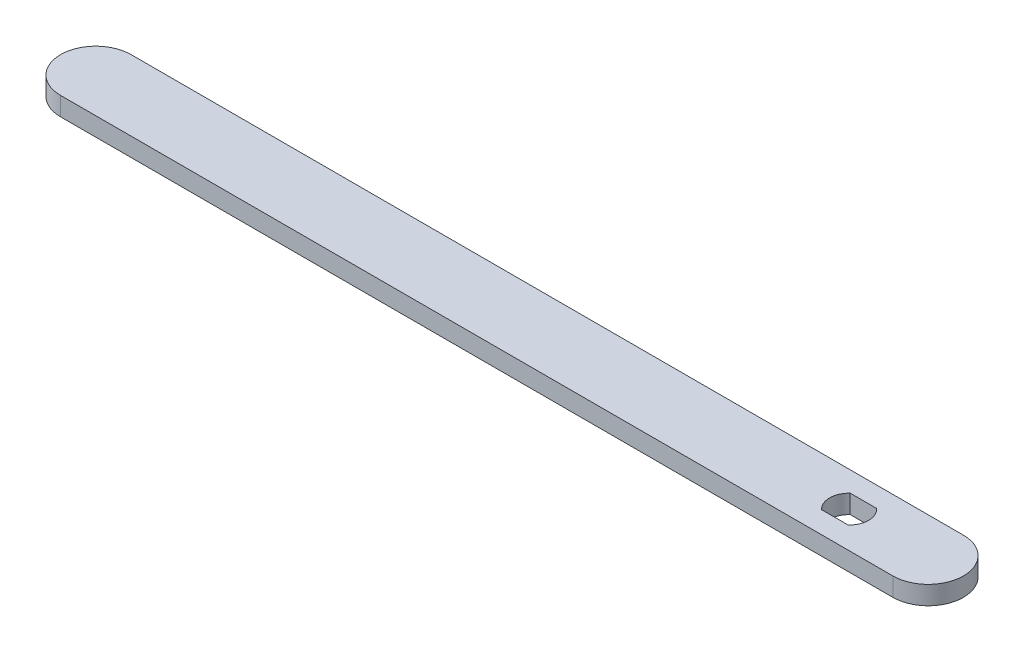
ISO-10303-21;
HEADER;
FILE_DESCRIPTION(('STEP AP214'),'2;1');
FILE_NAME('part.step','',(''),(''),'','','');
FILE_SCHEMA(('AUTOMOTIVE_DESIGN { 1 0 10303 214 1 1 1 1 }'));
ENDSEC;
DATA;
#1=APPLICATION_CONTEXT('core data for automotive mechanical design processes');
#2=APPLICATION_PROTOCOL_DEFINITION('international standard','automotive_design',2000,#1);
#3=PRODUCT_CONTEXT('',#1,'mechanical');
#4=PRODUCT('Part','Part','',(#3));
#5=PRODUCT_RELATED_PRODUCT_CATEGORY('part','',(#4));
#6=PRODUCT_DEFINITION_FORMATION('','',#4);
#7=PRODUCT_DEFINITION_CONTEXT('part definition',#1,'design');
#8=PRODUCT_DEFINITION('design','',#6,#7);
#9=PRODUCT_DEFINITION_SHAPE('','',#8);
#10=(LENGTH_UNIT() NAMED_UNIT(*) SI_UNIT(.MILLI.,.METRE.));
#11=(NAMED_UNIT(*) PLANE_ANGLE_UNIT() SI_UNIT($,.RADIAN.));
#12=(NAMED_UNIT(*) SI_UNIT($,.STERADIAN.) SOLID_ANGLE_UNIT());
#13=UNCERTAINTY_MEASURE_WITH_UNIT(LENGTH_MEASURE(1.E-05),#10,'distance_accuracy_value','');
#14=(GEOMETRIC_REPRESENTATION_CONTEXT(3) GLOBAL_UNCERTAINTY_ASSIGNED_CONTEXT((#13)) GLOBAL_UNIT_ASSIGNED_CONTEXT((#10,
#11,#12)) REPRESENTATION_CONTEXT('',''));
#15=CARTESIAN_POINT('',(0.,0.,0.));
#16=DIRECTION('',(0.,0.,1.));
#17=DIRECTION('',(1.,0.,0.));
#18=AXIS2_PLACEMENT_3D('',#15,#16,#17);
#19=CARTESIAN_POINT('',(-11.5300829875519,2.5,0.));
#20=DIRECTION('',(0.,-1.,0.));
#21=DIRECTION('',(0.,0.,-1.));
#22=AXIS2_PLACEMENT_3D('',#19,#20,#21);
#23=CYLINDRICAL_SURFACE('',#22,4.75);
#24=CARTESIAN_POINT('',(-11.5300829875519,0.,0.));
#25=DIRECTION('',(0.,1.,0.));
#26=DIRECTION('',(0.,0.,1.));
#27=AXIS2_PLACEMENT_3D('',#24,#25,#26);
#28=CIRCLE('',#27,4.75);
#29=CARTESIAN_POINT('',(-11.5300829875519,0.,-4.75));
#30=VERTEX_POINT('',#29);
#31=CARTESIAN_POINT('',(-11.5300829875519,0.,4.75));
#32=VERTEX_POINT('',#31);
#33=EDGE_CURVE('E154',#30,#32,#28,.T.);
#34=ORIENTED_EDGE('',*,*,#33,.T.);
#35=DIRECTION('',(0.,-1.,0.));
#36=VECTOR('',#35,1.);
#37=CARTESIAN_POINT('',(-11.5300829875519,2.5,4.75));
#38=LINE('',#37,#36);
#39=CARTESIAN_POINT('',(-11.5300829875519,2.5,4.75));
#40=VERTEX_POINT('',#39);
#41=EDGE_CURVE('E11',#40,#32,#38,.T.);
#42=ORIENTED_EDGE('',*,*,#41,.F.);
#43=CARTESIAN_POINT('',(-11.5300829875519,2.5,0.));
#44=DIRECTION('',(0.,1.,0.));
#45=DIRECTION('',(0.,0.,1.));
#46=AXIS2_PLACEMENT_3D('',#43,#44,#45);
#47=CIRCLE('',#46,4.75);
#48=CARTESIAN_POINT('',(-11.5300829875519,2.5,-4.75));
#49=VERTEX_POINT('',#48);
#50=EDGE_CURVE('E163',#49,#40,#47,.T.);
#51=ORIENTED_EDGE('',*,*,#50,.F.);
#52=DIRECTION('',(0.,-1.,0.));
#53=VECTOR('',#52,1.);
#54=CARTESIAN_POINT('',(-11.5300829875519,2.5,-4.75));
#55=LINE('',#54,#53);
#56=EDGE_CURVE('E119',#49,#30,#55,.T.);
#57=ORIENTED_EDGE('',*,*,#56,.T.);
#58=EDGE_LOOP('',(#34,#42,#51,#57));
#59=FACE_BOUND('',#58,.T.);
#60=ADVANCED_FACE('F47',(#59),#23,.T.);
#61=CARTESIAN_POINT('',(-11.5300829875519,2.5,4.75));
#62=DIRECTION('',(0.,0.,-1.));
#63=DIRECTION('',(-1.,0.,0.));
#64=AXIS2_PLACEMENT_3D('',#61,#62,#63);
#65=PLANE('',#64);
#66=DIRECTION('',(1.,0.,0.));
#67=VECTOR('',#66,1.);
#68=CARTESIAN_POINT('',(-11.5300829875519,0.,4.75));
#69=LINE('',#68,#67);
#70=CARTESIAN_POINT('',(100.469917012448,0.,4.75));
#71=VERTEX_POINT('',#70);
#72=EDGE_CURVE('E103',#32,#71,#69,.T.);
#73=ORIENTED_EDGE('',*,*,#72,.T.);
#74=DIRECTION('',(0.,-1.,0.));
#75=VECTOR('',#74,1.);
#76=CARTESIAN_POINT('',(100.469917012448,2.5,4.75));
#77=LINE('',#76,#75);
#78=CARTESIAN_POINT('',(100.469917012448,2.5,4.75));
#79=VERTEX_POINT('',#78);
#80=EDGE_CURVE('E56',#79,#71,#77,.T.);
#81=ORIENTED_EDGE('',*,*,#80,.F.);
#82=DIRECTION('',(1.,0.,0.));
#83=VECTOR('',#82,1.);
#84=CARTESIAN_POINT('',(-11.5300829875519,2.5,4.75));
#85=LINE('',#84,#83);
#86=EDGE_CURVE('E126',#40,#79,#85,.T.);
#87=ORIENTED_EDGE('',*,*,#86,.F.);
#88=ORIENTED_EDGE('',*,*,#41,.T.);
#89=EDGE_LOOP('',(#73,#81,#87,#88));
#90=FACE_BOUND('',#89,.T.);
#91=ADVANCED_FACE('F200',(#90),#65,.F.);
#92=CARTESIAN_POINT('',(100.469917012448,2.5,0.));
#93=DIRECTION('',(0.,-1.,0.));
#94=DIRECTION('',(0.,0.,-1.));
#95=AXIS2_PLACEMENT_3D('',#92,#93,#94);
#96=CYLINDRICAL_SURFACE('',#95,4.75);
#97=CARTESIAN_POINT('',(100.469917012448,0.,0.));
#98=DIRECTION('',(0.,1.,0.));
#99=DIRECTION('',(0.,0.,1.));
#100=AXIS2_PLACEMENT_3D('',#97,#98,#99);
#101=CIRCLE('',#100,4.75);
#102=CARTESIAN_POINT('',(100.469917012448,0.,-4.75));
#103=VERTEX_POINT('',#102);
#104=EDGE_CURVE('E143',#71,#103,#101,.T.);
#105=ORIENTED_EDGE('',*,*,#104,.T.);
#106=DIRECTION('',(0.,-1.,0.));
#107=VECTOR('',#106,1.);
#108=CARTESIAN_POINT('',(100.469917012448,2.5,-4.75));
#109=LINE('',#108,#107);
#110=CARTESIAN_POINT('',(100.469917012448,2.5,-4.75));
#111=VERTEX_POINT('',#110);
#112=EDGE_CURVE('E112',#111,#103,#109,.T.);
#113=ORIENTED_EDGE('',*,*,#112,.F.);
#114=CARTESIAN_POINT('',(100.469917012448,2.5,0.));
#115=DIRECTION('',(0.,1.,0.));
#116=DIRECTION('',(0.,0.,1.));
#117=AXIS2_PLACEMENT_3D('',#114,#115,#116);
#118=CIRCLE('',#117,4.75);
#119=EDGE_CURVE('E135',#79,#111,#118,.T.);
#120=ORIENTED_EDGE('',*,*,#119,.F.);
#121=ORIENTED_EDGE('',*,*,#80,.T.);
#122=EDGE_LOOP('',(#105,#113,#120,#121));
#123=FACE_BOUND('',#122,.T.);
#124=ADVANCED_FACE('F142',(#123),#96,.T.);
#125=CARTESIAN_POINT('',(-11.5300829875519,2.5,-4.75));
#126=DIRECTION('',(0.,0.,-1.));
#127=DIRECTION('',(-1.,0.,0.));
#128=AXIS2_PLACEMENT_3D('',#125,#126,#127);
#129=PLANE('',#128);
#130=DIRECTION('',(1.,0.,0.));
#131=VECTOR('',#130,1.);
#132=CARTESIAN_POINT('',(-11.5300829875519,0.,-4.75));
#133=LINE('',#132,#131);
#134=EDGE_CURVE('E161',#30,#103,#133,.T.);
#135=ORIENTED_EDGE('',*,*,#134,.F.);
#136=ORIENTED_EDGE('',*,*,#56,.F.);
#137=DIRECTION('',(1.,0.,0.));
#138=VECTOR('',#137,1.);
#139=CARTESIAN_POINT('',(-11.5300829875519,2.5,-4.75));
#140=LINE('',#139,#138);
#141=EDGE_CURVE('E137',#49,#111,#140,.T.);
#142=ORIENTED_EDGE('',*,*,#141,.T.);
#143=ORIENTED_EDGE('',*,*,#112,.T.);
#144=EDGE_LOOP('',(#135,#136,#142,#143));
#145=FACE_BOUND('',#144,.T.);
#146=ADVANCED_FACE('F147',(#145),#129,.T.);
#147=CARTESIAN_POINT('',(-11.5300829875519,2.5,0.));
#148=DIRECTION('',(0.,1.,0.));
#149=DIRECTION('',(0.,0.,1.));
#150=AXIS2_PLACEMENT_3D('',#147,#148,#149);
#151=PLANE('',#150);
#152=CARTESIAN_POINT('',(89.7391086353592,2.5,-0.100316283306491));
#153=DIRECTION('',(0.,1.,0.));
#154=DIRECTION('',(0.,0.,1.));
#155=AXIS2_PLACEMENT_3D('',#152,#153,#154);
#156=CIRCLE('',#155,2.625);
#157=CARTESIAN_POINT('',(87.9544518056017,2.5,-2.02531628330649));
#158=VERTEX_POINT('',#157);
#159=CARTESIAN_POINT('',(87.9544518056017,2.5,1.82468371669351));
#160=VERTEX_POINT('',#159);
#161=EDGE_CURVE('E50',#158,#160,#156,.T.);
#162=ORIENTED_EDGE('',*,*,#161,.F.);
#163=DIRECTION('',(-1.,0.,0.));
#164=VECTOR('',#163,1.);
#165=CARTESIAN_POINT('',(87.9544518056017,2.5,-2.02531628330649));
#166=LINE('',#165,#164);
#167=CARTESIAN_POINT('',(91.5237654651166,2.5,-2.02531628330649));
#168=VERTEX_POINT('',#167);
#169=EDGE_CURVE('E94',#168,#158,#166,.T.);
#170=ORIENTED_EDGE('',*,*,#169,.F.);
#171=CARTESIAN_POINT('',(89.7391086353592,2.5,-0.100316283306491));
#172=DIRECTION('',(0.,1.,0.));
#173=DIRECTION('',(0.,0.,1.));
#174=AXIS2_PLACEMENT_3D('',#171,#172,#173);
#175=CIRCLE('',#174,2.625);
#176=CARTESIAN_POINT('',(91.5237654651166,2.5,1.82468371669351));
#177=VERTEX_POINT('',#176);
#178=EDGE_CURVE('E170',#177,#168,#175,.T.);
#179=ORIENTED_EDGE('',*,*,#178,.F.);
#180=DIRECTION('',(1.,0.,0.));
#181=VECTOR('',#180,1.);
#182=CARTESIAN_POINT('',(87.9544518056017,2.5,1.82468371669351));
#183=LINE('',#182,#181);
#184=EDGE_CURVE('E167',#160,#177,#183,.T.);
#185=ORIENTED_EDGE('',*,*,#184,.F.);
#186=EDGE_LOOP('',(#162,#170,#179,#185));
#187=FACE_BOUND('',#186,.T.);
#188=ORIENTED_EDGE('',*,*,#50,.T.);
#189=ORIENTED_EDGE('',*,*,#86,.T.);
#190=ORIENTED_EDGE('',*,*,#119,.T.);
#191=ORIENTED_EDGE('',*,*,#141,.F.);
#192=EDGE_LOOP('',(#188,#189,#190,#191));
#193=FACE_BOUND('',#192,.T.);
#194=ADVANCED_FACE('F136',(#187,#193),#151,.T.);
#195=CARTESIAN_POINT('',(-11.5300829875519,0.,0.));
#196=DIRECTION('',(0.,1.,0.));
#197=DIRECTION('',(0.,0.,1.));
#198=AXIS2_PLACEMENT_3D('',#195,#196,#197);
#199=PLANE('',#198);
#200=DIRECTION('',(-1.,0.,0.));
#201=VECTOR('',#200,1.);
#202=CARTESIAN_POINT('',(87.9544518056017,0.,-2.02531628330649));
#203=LINE('',#202,#201);
#204=CARTESIAN_POINT('',(91.5237654651166,0.,-2.02531628330649));
#205=VERTEX_POINT('',#204);
#206=CARTESIAN_POINT('',(87.9544518056017,0.,-2.02531628330649));
#207=VERTEX_POINT('',#206);
#208=EDGE_CURVE('E193',#205,#207,#203,.T.);
#209=ORIENTED_EDGE('',*,*,#208,.T.);
#210=CARTESIAN_POINT('',(89.7391086353592,0.,-0.100316283306491));
#211=DIRECTION('',(0.,1.,0.));
#212=DIRECTION('',(0.,0.,1.));
#213=AXIS2_PLACEMENT_3D('',#210,#211,#212);
#214=CIRCLE('',#213,2.625);
#215=CARTESIAN_POINT('',(87.9544518056017,0.,1.82468371669351));
#216=VERTEX_POINT('',#215);
#217=EDGE_CURVE('E327',#207,#216,#214,.T.);
#218=ORIENTED_EDGE('',*,*,#217,.T.);
#219=DIRECTION('',(1.,0.,0.));
#220=VECTOR('',#219,1.);
#221=CARTESIAN_POINT('',(87.9544518056017,0.,1.82468371669351));
#222=LINE('',#221,#220);
#223=CARTESIAN_POINT('',(91.5237654651166,0.,1.82468371669351));
#224=VERTEX_POINT('',#223);
#225=EDGE_CURVE('E332',#216,#224,#222,.T.);
#226=ORIENTED_EDGE('',*,*,#225,.T.);
#227=CARTESIAN_POINT('',(89.7391086353592,0.,-0.100316283306491));
#228=DIRECTION('',(0.,1.,0.));
#229=DIRECTION('',(0.,0.,1.));
#230=AXIS2_PLACEMENT_3D('',#227,#228,#229);
#231=CIRCLE('',#230,2.625);
#232=EDGE_CURVE('E73',#224,#205,#231,.T.);
#233=ORIENTED_EDGE('',*,*,#232,.T.);
#234=EDGE_LOOP('',(#209,#218,#226,#233));
#235=FACE_BOUND('',#234,.T.);
#236=ORIENTED_EDGE('',*,*,#33,.F.);
#237=ORIENTED_EDGE('',*,*,#134,.T.);
#238=ORIENTED_EDGE('',*,*,#104,.F.);
#239=ORIENTED_EDGE('',*,*,#72,.F.);
#240=EDGE_LOOP('',(#236,#237,#238,#239));
#241=FACE_BOUND('',#240,.T.);
#242=ADVANCED_FACE('F201',(#235,#241),#199,.F.);
#243=CARTESIAN_POINT('',(89.7391086353592,0.,-0.100316283306491));
#244=DIRECTION('',(0.,1.,0.));
#245=DIRECTION('',(0.,0.,1.));
#246=AXIS2_PLACEMENT_3D('',#243,#244,#245);
#247=CYLINDRICAL_SURFACE('',#246,2.625);
#248=ORIENTED_EDGE('',*,*,#161,.T.);
#249=DIRECTION('',(0.,1.,0.));
#250=VECTOR('',#249,1.);
#251=CARTESIAN_POINT('',(87.9544518056017,0.,1.82468371669351));
#252=LINE('',#251,#250);
#253=EDGE_CURVE('E64',#216,#160,#252,.T.);
#254=ORIENTED_EDGE('',*,*,#253,.F.);
#255=ORIENTED_EDGE('',*,*,#217,.F.);
#256=DIRECTION('',(0.,1.,0.));
#257=VECTOR('',#256,1.);
#258=CARTESIAN_POINT('',(87.9544518056017,0.,-2.02531628330649));
#259=LINE('',#258,#257);
#260=EDGE_CURVE('E171',#207,#158,#259,.T.);
#261=ORIENTED_EDGE('',*,*,#260,.T.);
#262=EDGE_LOOP('',(#248,#254,#255,#261));
#263=FACE_BOUND('',#262,.T.);
#264=ADVANCED_FACE('F178',(#263),#247,.F.);
#265=CARTESIAN_POINT('',(87.9544518056017,0.,-2.02531628330649));
#266=DIRECTION('',(0.,0.,-1.));
#267=DIRECTION('',(-1.,0.,0.));
#268=AXIS2_PLACEMENT_3D('',#265,#266,#267);
#269=PLANE('',#268);
#270=ORIENTED_EDGE('',*,*,#169,.T.);
#271=ORIENTED_EDGE('',*,*,#260,.F.);
#272=ORIENTED_EDGE('',*,*,#208,.F.);
#273=DIRECTION('',(0.,1.,0.));
#274=VECTOR('',#273,1.);
#275=CARTESIAN_POINT('',(91.5237654651166,0.,-2.02531628330649));
#276=LINE('',#275,#274);
#277=EDGE_CURVE('E188',#205,#168,#276,.T.);
#278=ORIENTED_EDGE('',*,*,#277,.T.);
#279=EDGE_LOOP('',(#270,#271,#272,#278));
#280=FACE_BOUND('',#279,.T.);
#281=ADVANCED_FACE('F209',(#280),#269,.F.);
#282=CARTESIAN_POINT('',(89.7391086353592,0.,-0.100316283306491));
#283=DIRECTION('',(0.,1.,0.));
#284=DIRECTION('',(0.,0.,1.));
#285=AXIS2_PLACEMENT_3D('',#282,#283,#284);
#286=CYLINDRICAL_SURFACE('',#285,2.625);
#287=ORIENTED_EDGE('',*,*,#178,.T.);
#288=ORIENTED_EDGE('',*,*,#277,.F.);
#289=ORIENTED_EDGE('',*,*,#232,.F.);
#290=DIRECTION('',(0.,1.,0.));
#291=VECTOR('',#290,1.);
#292=CARTESIAN_POINT('',(91.5237654651166,0.,1.82468371669351));
#293=LINE('',#292,#291);
#294=EDGE_CURVE('E184',#224,#177,#293,.T.);
#295=ORIENTED_EDGE('',*,*,#294,.T.);
#296=EDGE_LOOP('',(#287,#288,#289,#295));
#297=FACE_BOUND('',#296,.T.);
#298=ADVANCED_FACE('F186',(#297),#286,.F.);
#299=CARTESIAN_POINT('',(87.9544518056017,0.,1.82468371669351));
#300=DIRECTION('',(0.,0.,1.));
#301=DIRECTION('',(1.,0.,0.));
#302=AXIS2_PLACEMENT_3D('',#299,#300,#301);
#303=PLANE('',#302);
#304=ORIENTED_EDGE('',*,*,#184,.T.);
#305=ORIENTED_EDGE('',*,*,#294,.F.);
#306=ORIENTED_EDGE('',*,*,#225,.F.);
#307=ORIENTED_EDGE('',*,*,#253,.T.);
#308=EDGE_LOOP('',(#304,#305,#306,#307));
#309=FACE_BOUND('',#308,.T.);
#310=ADVANCED_FACE('F183',(#309),#303,.F.);
#311=CLOSED_SHELL('',(#60,#91,#124,#146,#194,#242,#264,#281,#298,#310));
#312=MANIFOLD_SOLID_BREP('B2',#311);
#313=ADVANCED_BREP_SHAPE_REPRESENTATION('',(#18,#312),#14);
#314=SHAPE_DEFINITION_REPRESENTATION(#9,#313);
ENDSEC;
END-ISO-10303-21;
